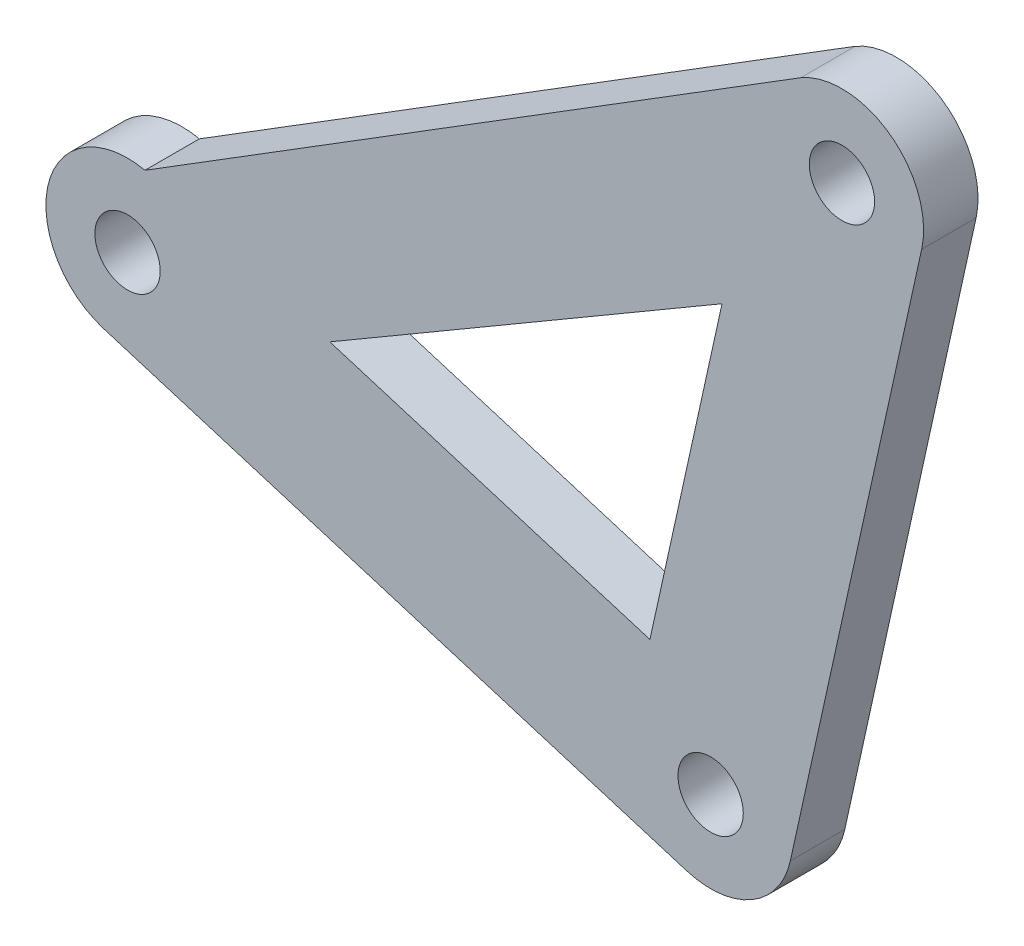
ISO-10303-21;
HEADER;
FILE_DESCRIPTION(('STEP AP214'),'2;1');
FILE_NAME('part.step','',(''),(''),'','','');
FILE_SCHEMA(('AUTOMOTIVE_DESIGN { 1 0 10303 214 1 1 1 1 }'));
ENDSEC;
DATA;
#1=APPLICATION_CONTEXT('core data for automotive mechanical design processes');
#2=APPLICATION_PROTOCOL_DEFINITION('international standard','automotive_design',2000,#1);
#3=PRODUCT_CONTEXT('',#1,'mechanical');
#4=PRODUCT('Part','Part','',(#3));
#5=PRODUCT_RELATED_PRODUCT_CATEGORY('part','',(#4));
#6=PRODUCT_DEFINITION_FORMATION('','',#4);
#7=PRODUCT_DEFINITION_CONTEXT('part definition',#1,'design');
#8=PRODUCT_DEFINITION('design','',#6,#7);
#9=PRODUCT_DEFINITION_SHAPE('','',#8);
#10=(LENGTH_UNIT() NAMED_UNIT(*) SI_UNIT(.MILLI.,.METRE.));
#11=(NAMED_UNIT(*) PLANE_ANGLE_UNIT() SI_UNIT($,.RADIAN.));
#12=(NAMED_UNIT(*) SI_UNIT($,.STERADIAN.) SOLID_ANGLE_UNIT());
#13=UNCERTAINTY_MEASURE_WITH_UNIT(LENGTH_MEASURE(1.E-05),#10,'distance_accuracy_value','');
#14=(GEOMETRIC_REPRESENTATION_CONTEXT(3) GLOBAL_UNCERTAINTY_ASSIGNED_CONTEXT((#13)) GLOBAL_UNIT_ASSIGNED_CONTEXT((#10,
#11,#12)) REPRESENTATION_CONTEXT('',''));
#15=CARTESIAN_POINT('',(0.,0.,0.));
#16=DIRECTION('',(0.,0.,1.));
#17=DIRECTION('',(1.,0.,0.));
#18=AXIS2_PLACEMENT_3D('',#15,#16,#17);
#19=CARTESIAN_POINT('',(-67.5130338509924,14.8921394679262,-5.));
#20=DIRECTION('',(0.976525116836569,-0.215403565864925,0.));
#21=DIRECTION('',(0.215403565864925,0.976525116836569,0.));
#22=AXIS2_PLACEMENT_3D('',#19,#20,#21);
#23=PLANE('',#22);
#24=DIRECTION('',(0.215403565864925,0.976525116836569,0.));
#25=VECTOR('',#24,1.);
#26=CARTESIAN_POINT('',(-67.5130338509924,14.8921394679262,0.));
#27=LINE('',#26,#25);
#28=CARTESIAN_POINT('',(-69.5751762676714,5.5434833475172,0.));
#29=VERTEX_POINT('',#28);
#30=CARTESIAN_POINT('',(-62.9531698060001,35.5641360127153,0.));
#31=VERTEX_POINT('',#30);
#32=EDGE_CURVE('E159',#29,#31,#27,.T.);
#33=ORIENTED_EDGE('',*,*,#32,.T.);
#34=DIRECTION('',(0.,0.,1.));
#35=VECTOR('',#34,1.);
#36=CARTESIAN_POINT('',(-62.9531698060001,35.5641360127153,-5.));
#37=LINE('',#36,#35);
#38=CARTESIAN_POINT('',(-62.9531698060001,35.5641360127153,-5.));
#39=VERTEX_POINT('',#38);
#40=EDGE_CURVE('E11',#39,#31,#37,.T.);
#41=ORIENTED_EDGE('',*,*,#40,.F.);
#42=DIRECTION('',(0.215403565864925,0.976525116836569,0.));
#43=VECTOR('',#42,1.);
#44=CARTESIAN_POINT('',(-67.5130338509924,14.8921394679262,-5.));
#45=LINE('',#44,#43);
#46=CARTESIAN_POINT('',(-69.5751762676714,5.5434833475172,-5.));
#47=VERTEX_POINT('',#46);
#48=EDGE_CURVE('E120',#47,#39,#45,.T.);
#49=ORIENTED_EDGE('',*,*,#48,.F.);
#50=DIRECTION('',(0.,0.,1.));
#51=VECTOR('',#50,1.);
#52=CARTESIAN_POINT('',(-69.5751762676714,5.5434833475172,-5.));
#53=LINE('',#52,#51);
#54=EDGE_CURVE('E125',#47,#29,#53,.T.);
#55=ORIENTED_EDGE('',*,*,#54,.T.);
#56=EDGE_LOOP('',(#33,#41,#49,#55));
#57=FACE_BOUND('',#56,.T.);
#58=ADVANCED_FACE('F39',(#57),#23,.F.);
#59=CARTESIAN_POINT('',(-31.5076413819131,53.9341962318663,-5.));
#60=DIRECTION('',(-0.504420709932172,0.86345801715632,0.));
#61=DIRECTION('',(-0.86345801715632,-0.504420709932172,0.));
#62=AXIS2_PLACEMENT_3D('',#59,#60,#61);
#63=PLANE('',#62);
#64=DIRECTION('',(-0.86345801715632,-0.504420709932172,0.));
#65=VECTOR('',#64,1.);
#66=CARTESIAN_POINT('',(-31.5076413819131,53.9341962318663,0.));
#67=LINE('',#66,#65);
#68=CARTESIAN_POINT('',(-98.978129472026,14.5188328607905,0.));
#69=VERTEX_POINT('',#68);
#70=EDGE_CURVE('E86',#31,#69,#67,.T.);
#71=ORIENTED_EDGE('',*,*,#70,.T.);
#72=DIRECTION('',(0.,0.,1.));
#73=VECTOR('',#72,1.);
#74=CARTESIAN_POINT('',(-98.978129472026,14.5188328607905,-5.));
#75=LINE('',#74,#73);
#76=CARTESIAN_POINT('',(-98.978129472026,14.5188328607905,-5.));
#77=VERTEX_POINT('',#76);
#78=EDGE_CURVE('E49',#77,#69,#75,.T.);
#79=ORIENTED_EDGE('',*,*,#78,.F.);
#80=DIRECTION('',(-0.86345801715632,-0.504420709932172,0.));
#81=VECTOR('',#80,1.);
#82=CARTESIAN_POINT('',(-31.5076413819131,53.9341962318663,-5.));
#83=LINE('',#82,#81);
#84=EDGE_CURVE('E57',#39,#77,#83,.T.);
#85=ORIENTED_EDGE('',*,*,#84,.F.);
#86=ORIENTED_EDGE('',*,*,#40,.T.);
#87=EDGE_LOOP('',(#71,#79,#85,#86));
#88=FACE_BOUND('',#87,.T.);
#89=ADVANCED_FACE('F217',(#88),#63,.F.);
#90=CARTESIAN_POINT('',(-8.76177626714497,-28.7032941936022,-5.));
#91=DIRECTION('',(-0.291954153357192,-0.956432314561509,0.));
#92=DIRECTION('',(0.956432314561509,-0.291954153357193,0.));
#93=AXIS2_PLACEMENT_3D('',#90,#91,#92);
#94=PLANE('',#93);
#95=DIRECTION('',(0.956432314561509,-0.291954153357192,0.));
#96=VECTOR('',#95,1.);
#97=CARTESIAN_POINT('',(-8.76177626714497,-28.7032941936022,0.));
#98=LINE('',#97,#96);
#99=CARTESIAN_POINT('',(-119.749865765623,5.17619022879147,0.));
#100=VERTEX_POINT('',#99);
#101=CARTESIAN_POINT('',(-66.1896561501789,-11.1732423592113,0.));
#102=VERTEX_POINT('',#101);
#103=EDGE_CURVE('E140',#100,#102,#98,.T.);
#104=ORIENTED_EDGE('',*,*,#103,.F.);
#105=DIRECTION('',(0.,0.,1.));
#106=VECTOR('',#105,1.);
#107=CARTESIAN_POINT('',(-119.749865765623,5.17619022879147,-5.));
#108=LINE('',#107,#106);
#109=CARTESIAN_POINT('',(-119.749865765623,5.17619022879147,-5.));
#110=VERTEX_POINT('',#109);
#111=EDGE_CURVE('E130',#110,#100,#108,.T.);
#112=ORIENTED_EDGE('',*,*,#111,.F.);
#113=DIRECTION('',(0.956432314561509,-0.291954153357192,0.));
#114=VECTOR('',#113,1.);
#115=CARTESIAN_POINT('',(-8.76177626714497,-28.7032941936022,-5.));
#116=LINE('',#115,#114);
#117=CARTESIAN_POINT('',(-66.1896561501789,-11.1732423592113,-5.));
#118=VERTEX_POINT('',#117);
#119=EDGE_CURVE('E162',#110,#118,#116,.T.);
#120=ORIENTED_EDGE('',*,*,#119,.T.);
#121=DIRECTION('',(0.,0.,1.));
#122=VECTOR('',#121,1.);
#123=CARTESIAN_POINT('',(-66.1896561501789,-11.1732423592113,-5.));
#124=LINE('',#123,#122);
#125=EDGE_CURVE('E43',#118,#102,#124,.T.);
#126=ORIENTED_EDGE('',*,*,#125,.T.);
#127=EDGE_LOOP('',(#104,#112,#120,#126));
#128=FACE_BOUND('',#127,.T.);
#129=ADVANCED_FACE('F41',(#128),#94,.T.);
#130=CARTESIAN_POINT('',(-117.560209615445,12.3494325880028,-5.));
#131=DIRECTION('',(0.,0.,1.));
#132=DIRECTION('',(1.,0.,0.));
#133=AXIS2_PLACEMENT_3D('',#130,#131,#132);
#134=CYLINDRICAL_SURFACE('',#133,7.50000000000001);
#135=CARTESIAN_POINT('',(-117.560209615445,12.3494325880028,0.));
#136=DIRECTION('',(0.,0.,1.));
#137=DIRECTION('',(1.,0.,0.));
#138=AXIS2_PLACEMENT_3D('',#135,#136,#137);
#139=CIRCLE('',#138,7.50000000000001);
#140=CARTESIAN_POINT('',(-115.960936395005,19.6769372905864,0.));
#141=VERTEX_POINT('',#140);
#142=EDGE_CURVE('E156',#141,#100,#139,.T.);
#143=ORIENTED_EDGE('',*,*,#142,.F.);
#144=DIRECTION('',(0.,0.,1.));
#145=VECTOR('',#144,1.);
#146=CARTESIAN_POINT('',(-115.960936395005,19.6769372905864,-5.));
#147=LINE('',#146,#145);
#148=CARTESIAN_POINT('',(-115.960936395005,19.6769372905864,-5.));
#149=VERTEX_POINT('',#148);
#150=EDGE_CURVE('E166',#149,#141,#147,.T.);
#151=ORIENTED_EDGE('',*,*,#150,.F.);
#152=CARTESIAN_POINT('',(-117.560209615445,12.3494325880028,-5.));
#153=DIRECTION('',(0.,0.,1.));
#154=DIRECTION('',(1.,0.,0.));
#155=AXIS2_PLACEMENT_3D('',#152,#153,#154);
#156=CIRCLE('',#155,7.50000000000001);
#157=EDGE_CURVE('E132',#149,#110,#156,.T.);
#158=ORIENTED_EDGE('',*,*,#157,.T.);
#159=ORIENTED_EDGE('',*,*,#111,.T.);
#160=EDGE_LOOP('',(#143,#151,#158,#159));
#161=FACE_BOUND('',#160,.T.);
#162=ADVANCED_FACE('F183',(#161),#134,.T.);
#163=CARTESIAN_POINT('',(-41.1933079282723,66.200879947341,-5.));
#164=DIRECTION('',(-0.528317135641569,0.849047115410852,0.));
#165=DIRECTION('',(-0.849047115410852,-0.528317135641569,0.));
#166=AXIS2_PLACEMENT_3D('',#163,#164,#165);
#167=PLANE('',#166);
#168=DIRECTION('',(-0.849047115410852,-0.528317135641569,0.));
#169=VECTOR('',#168,1.);
#170=CARTESIAN_POINT('',(-41.1933079282723,66.200879947341,0.));
#171=LINE('',#170,#169);
#172=CARTESIAN_POINT('',(-55.7205556360555,57.1613416715203,0.));
#173=VERTEX_POINT('',#172);
#174=EDGE_CURVE('E153',#173,#141,#171,.T.);
#175=ORIENTED_EDGE('',*,*,#174,.F.);
#176=DIRECTION('',(0.,0.,1.));
#177=VECTOR('',#176,1.);
#178=CARTESIAN_POINT('',(-55.7205556360555,57.1613416715203,-5.));
#179=LINE('',#178,#177);
#180=CARTESIAN_POINT('',(-55.7205556360555,57.1613416715203,-5.));
#181=VERTEX_POINT('',#180);
#182=EDGE_CURVE('E168',#181,#173,#179,.T.);
#183=ORIENTED_EDGE('',*,*,#182,.F.);
#184=DIRECTION('',(-0.849047115410852,-0.528317135641569,0.));
#185=VECTOR('',#184,1.);
#186=CARTESIAN_POINT('',(-41.1933079282723,66.200879947341,-5.));
#187=LINE('',#186,#185);
#188=EDGE_CURVE('E135',#181,#149,#187,.T.);
#189=ORIENTED_EDGE('',*,*,#188,.T.);
#190=ORIENTED_EDGE('',*,*,#150,.T.);
#191=EDGE_LOOP('',(#175,#183,#189,#190));
#192=FACE_BOUND('',#191,.T.);
#193=ADVANCED_FACE('F202',(#192),#167,.T.);
#194=CARTESIAN_POINT('',(-51.9374003115642,50.6854065428479,-5.));
#195=DIRECTION('',(0.,0.,1.));
#196=DIRECTION('',(1.,0.,0.));
#197=AXIS2_PLACEMENT_3D('',#194,#195,#196);
#198=CYLINDRICAL_SURFACE('',#197,7.50000000000001);
#199=CARTESIAN_POINT('',(-51.9374003115642,50.6854065428479,0.));
#200=DIRECTION('',(0.,0.,1.));
#201=DIRECTION('',(1.,0.,0.));
#202=AXIS2_PLACEMENT_3D('',#199,#200,#201);
#203=CIRCLE('',#202,7.50000000000001);
#204=CARTESIAN_POINT('',(-44.6134619352899,49.0698797988609,0.));
#205=VERTEX_POINT('',#204);
#206=EDGE_CURVE('E150',#205,#173,#203,.T.);
#207=ORIENTED_EDGE('',*,*,#206,.F.);
#208=DIRECTION('',(0.,0.,1.));
#209=VECTOR('',#208,1.);
#210=CARTESIAN_POINT('',(-44.6134619352899,49.0698797988609,-5.));
#211=LINE('',#210,#209);
#212=CARTESIAN_POINT('',(-44.6134619352899,49.0698797988609,-5.));
#213=VERTEX_POINT('',#212);
#214=EDGE_CURVE('E170',#213,#205,#211,.T.);
#215=ORIENTED_EDGE('',*,*,#214,.F.);
#216=CARTESIAN_POINT('',(-51.9374003115642,50.6854065428479,-5.));
#217=DIRECTION('',(0.,0.,1.));
#218=DIRECTION('',(1.,0.,0.));
#219=AXIS2_PLACEMENT_3D('',#216,#217,#218);
#220=CIRCLE('',#219,7.50000000000001);
#221=EDGE_CURVE('E199',#213,#181,#220,.T.);
#222=ORIENTED_EDGE('',*,*,#221,.T.);
#223=ORIENTED_EDGE('',*,*,#182,.T.);
#224=EDGE_LOOP('',(#207,#215,#222,#223));
#225=FACE_BOUND('',#224,.T.);
#226=ADVANCED_FACE('F206',(#225),#198,.T.);
#227=CARTESIAN_POINT('',(-52.8651570984439,11.6610859799524,-5.));
#228=DIRECTION('',(0.976525116836569,-0.215403565864925,0.));
#229=DIRECTION('',(0.215403565864925,0.976525116836569,0.));
#230=AXIS2_PLACEMENT_3D('',#227,#228,#229);
#231=PLANE('',#230);
#232=DIRECTION('',(0.215403565864925,0.976525116836569,0.));
#233=VECTOR('',#232,1.);
#234=CARTESIAN_POINT('',(-52.8651570984439,11.6610859799524,0.));
#235=LINE('',#234,#233);
#236=CARTESIAN_POINT('',(-56.6760616237257,-5.61552674398693,0.));
#237=VERTEX_POINT('',#236);
#238=EDGE_CURVE('E147',#237,#205,#235,.T.);
#239=ORIENTED_EDGE('',*,*,#238,.F.);
#240=DIRECTION('',(0.,0.,1.));
#241=VECTOR('',#240,1.);
#242=CARTESIAN_POINT('',(-56.6760616237257,-5.61552674398693,-5.));
#243=LINE('',#242,#241);
#244=CARTESIAN_POINT('',(-56.6760616237257,-5.61552674398693,-5.));
#245=VERTEX_POINT('',#244);
#246=EDGE_CURVE('E171',#245,#237,#243,.T.);
#247=ORIENTED_EDGE('',*,*,#246,.F.);
#248=DIRECTION('',(0.215403565864925,0.976525116836569,0.));
#249=VECTOR('',#248,1.);
#250=CARTESIAN_POINT('',(-52.8651570984439,11.6610859799524,-5.));
#251=LINE('',#250,#249);
#252=EDGE_CURVE('E191',#245,#213,#251,.T.);
#253=ORIENTED_EDGE('',*,*,#252,.T.);
#254=ORIENTED_EDGE('',*,*,#214,.T.);
#255=EDGE_LOOP('',(#239,#247,#253,#254));
#256=FACE_BOUND('',#255,.T.);
#257=ADVANCED_FACE('F208',(#256),#231,.T.);
#258=CARTESIAN_POINT('',(-64.,-4.00000000000001,-5.));
#259=DIRECTION('',(0.,0.,1.));
#260=DIRECTION('',(1.,0.,0.));
#261=AXIS2_PLACEMENT_3D('',#258,#259,#260);
#262=CYLINDRICAL_SURFACE('',#261,7.5);
#263=CARTESIAN_POINT('',(-64.,-4.00000000000001,0.));
#264=DIRECTION('',(0.,0.,1.));
#265=DIRECTION('',(1.,0.,0.));
#266=AXIS2_PLACEMENT_3D('',#263,#264,#265);
#267=CIRCLE('',#266,7.5);
#268=EDGE_CURVE('E143',#102,#237,#267,.T.);
#269=ORIENTED_EDGE('',*,*,#268,.F.);
#270=ORIENTED_EDGE('',*,*,#125,.F.);
#271=CARTESIAN_POINT('',(-64.,-4.00000000000001,-5.));
#272=DIRECTION('',(0.,0.,1.));
#273=DIRECTION('',(1.,0.,0.));
#274=AXIS2_PLACEMENT_3D('',#271,#272,#273);
#275=CIRCLE('',#274,7.5);
#276=EDGE_CURVE('E189',#118,#245,#275,.T.);
#277=ORIENTED_EDGE('',*,*,#276,.T.);
#278=ORIENTED_EDGE('',*,*,#246,.T.);
#279=EDGE_LOOP('',(#269,#270,#277,#278));
#280=FACE_BOUND('',#279,.T.);
#281=ADVANCED_FACE('F177',(#280),#262,.T.);
#282=CARTESIAN_POINT('',(-4.3824639667871,-14.3568094751796,-5.));
#283=DIRECTION('',(-0.291954153357193,-0.956432314561509,0.));
#284=DIRECTION('',(0.956432314561509,-0.291954153357193,0.));
#285=AXIS2_PLACEMENT_3D('',#282,#283,#284);
#286=PLANE('',#285);
#287=DIRECTION('',(0.956432314561509,-0.291954153357193,0.));
#288=VECTOR('',#287,1.);
#289=CARTESIAN_POINT('',(-4.3824639667871,-14.3568094751796,0.));
#290=LINE('',#289,#288);
#291=EDGE_CURVE('E127',#69,#29,#290,.T.);
#292=ORIENTED_EDGE('',*,*,#291,.T.);
#293=ORIENTED_EDGE('',*,*,#54,.F.);
#294=DIRECTION('',(0.956432314561509,-0.291954153357193,0.));
#295=VECTOR('',#294,1.);
#296=CARTESIAN_POINT('',(-4.3824639667871,-14.3568094751796,-5.));
#297=LINE('',#296,#295);
#298=EDGE_CURVE('E116',#77,#47,#297,.T.);
#299=ORIENTED_EDGE('',*,*,#298,.F.);
#300=ORIENTED_EDGE('',*,*,#78,.T.);
#301=EDGE_LOOP('',(#292,#293,#299,#300));
#302=FACE_BOUND('',#301,.T.);
#303=ADVANCED_FACE('F126',(#302),#286,.F.);
#304=CARTESIAN_POINT('',(0.,0.,-5.));
#305=DIRECTION('',(0.,0.,1.));
#306=DIRECTION('',(1.,0.,0.));
#307=AXIS2_PLACEMENT_3D('',#304,#305,#306);
#308=PLANE('',#307);
#309=CARTESIAN_POINT('',(-117.560209615445,12.3494325880028,-5.));
#310=DIRECTION('',(0.,0.,1.));
#311=DIRECTION('',(1.,0.,0.));
#312=AXIS2_PLACEMENT_3D('',#309,#310,#311);
#313=CIRCLE('',#312,3.00000000000001);
#314=CARTESIAN_POINT('',(-114.560209615444,12.3494325880028,-5.));
#315=VERTEX_POINT('',#314);
#316=EDGE_CURVE('E144',#315,#315,#313,.T.);
#317=ORIENTED_EDGE('',*,*,#316,.T.);
#318=EDGE_LOOP('',(#317));
#319=FACE_BOUND('',#318,.T.);
#320=CARTESIAN_POINT('',(-64.,-4.,-5.));
#321=DIRECTION('',(0.,0.,1.));
#322=DIRECTION('',(1.,0.,0.));
#323=AXIS2_PLACEMENT_3D('',#320,#321,#322);
#324=CIRCLE('',#323,3.);
#325=CARTESIAN_POINT('',(-61.,-4.,-5.));
#326=VERTEX_POINT('',#325);
#327=EDGE_CURVE('E420',#326,#326,#324,.T.);
#328=ORIENTED_EDGE('',*,*,#327,.T.);
#329=EDGE_LOOP('',(#328));
#330=FACE_BOUND('',#329,.T.);
#331=CARTESIAN_POINT('',(-51.9374003115642,50.6854065428479,-5.));
#332=DIRECTION('',(0.,0.,1.));
#333=DIRECTION('',(1.,0.,0.));
#334=AXIS2_PLACEMENT_3D('',#331,#332,#333);
#335=CIRCLE('',#334,3.00000000000001);
#336=CARTESIAN_POINT('',(-48.9374003115642,50.6854065428479,-5.));
#337=VERTEX_POINT('',#336);
#338=EDGE_CURVE('E194',#337,#337,#335,.T.);
#339=ORIENTED_EDGE('',*,*,#338,.T.);
#340=EDGE_LOOP('',(#339));
#341=FACE_BOUND('',#340,.T.);
#342=ORIENTED_EDGE('',*,*,#119,.F.);
#343=ORIENTED_EDGE('',*,*,#157,.F.);
#344=ORIENTED_EDGE('',*,*,#188,.F.);
#345=ORIENTED_EDGE('',*,*,#221,.F.);
#346=ORIENTED_EDGE('',*,*,#252,.F.);
#347=ORIENTED_EDGE('',*,*,#276,.F.);
#348=EDGE_LOOP('',(#342,#343,#344,#345,#346,#347));
#349=FACE_BOUND('',#348,.T.);
#350=ORIENTED_EDGE('',*,*,#48,.T.);
#351=ORIENTED_EDGE('',*,*,#84,.T.);
#352=ORIENTED_EDGE('',*,*,#298,.T.);
#353=EDGE_LOOP('',(#350,#351,#352));
#354=FACE_BOUND('',#353,.T.);
#355=ADVANCED_FACE('F118',(#319,#330,#341,#349,#354),#308,.F.);
#356=CARTESIAN_POINT('',(0.,0.,0.));
#357=DIRECTION('',(0.,0.,1.));
#358=DIRECTION('',(1.,0.,0.));
#359=AXIS2_PLACEMENT_3D('',#356,#357,#358);
#360=PLANE('',#359);
#361=CARTESIAN_POINT('',(-117.560209615445,12.3494325880028,0.));
#362=DIRECTION('',(0.,0.,1.));
#363=DIRECTION('',(1.,0.,0.));
#364=AXIS2_PLACEMENT_3D('',#361,#362,#363);
#365=CIRCLE('',#364,3.00000000000001);
#366=CARTESIAN_POINT('',(-114.560209615444,12.3494325880028,0.));
#367=VERTEX_POINT('',#366);
#368=EDGE_CURVE('E415',#367,#367,#365,.T.);
#369=ORIENTED_EDGE('',*,*,#368,.F.);
#370=EDGE_LOOP('',(#369));
#371=FACE_BOUND('',#370,.T.);
#372=CARTESIAN_POINT('',(-64.,-4.,0.));
#373=DIRECTION('',(0.,0.,1.));
#374=DIRECTION('',(1.,0.,0.));
#375=AXIS2_PLACEMENT_3D('',#372,#373,#374);
#376=CIRCLE('',#375,3.);
#377=CARTESIAN_POINT('',(-61.,-4.,0.));
#378=VERTEX_POINT('',#377);
#379=EDGE_CURVE('E416',#378,#378,#376,.T.);
#380=ORIENTED_EDGE('',*,*,#379,.F.);
#381=EDGE_LOOP('',(#380));
#382=FACE_BOUND('',#381,.T.);
#383=CARTESIAN_POINT('',(-51.9374003115642,50.6854065428479,0.));
#384=DIRECTION('',(0.,0.,1.));
#385=DIRECTION('',(1.,0.,0.));
#386=AXIS2_PLACEMENT_3D('',#383,#384,#385);
#387=CIRCLE('',#386,3.00000000000001);
#388=CARTESIAN_POINT('',(-48.9374003115642,50.6854065428479,0.));
#389=VERTEX_POINT('',#388);
#390=EDGE_CURVE('E424',#389,#389,#387,.T.);
#391=ORIENTED_EDGE('',*,*,#390,.F.);
#392=EDGE_LOOP('',(#391));
#393=FACE_BOUND('',#392,.T.);
#394=ORIENTED_EDGE('',*,*,#103,.T.);
#395=ORIENTED_EDGE('',*,*,#268,.T.);
#396=ORIENTED_EDGE('',*,*,#238,.T.);
#397=ORIENTED_EDGE('',*,*,#206,.T.);
#398=ORIENTED_EDGE('',*,*,#174,.T.);
#399=ORIENTED_EDGE('',*,*,#142,.T.);
#400=EDGE_LOOP('',(#394,#395,#396,#397,#398,#399));
#401=FACE_BOUND('',#400,.T.);
#402=ORIENTED_EDGE('',*,*,#32,.F.);
#403=ORIENTED_EDGE('',*,*,#291,.F.);
#404=ORIENTED_EDGE('',*,*,#70,.F.);
#405=EDGE_LOOP('',(#402,#403,#404));
#406=FACE_BOUND('',#405,.T.);
#407=ADVANCED_FACE('F179',(#371,#382,#393,#401,#406),#360,.T.);
#408=CARTESIAN_POINT('',(-51.9374003115642,50.6854065428479,-5.));
#409=DIRECTION('',(0.,0.,1.));
#410=DIRECTION('',(1.,0.,0.));
#411=AXIS2_PLACEMENT_3D('',#408,#409,#410);
#412=CYLINDRICAL_SURFACE('',#411,3.00000000000001);
#413=ORIENTED_EDGE('',*,*,#338,.F.);
#414=EDGE_LOOP('',(#413));
#415=FACE_BOUND('',#414,.T.);
#416=ORIENTED_EDGE('',*,*,#390,.T.);
#417=EDGE_LOOP('',(#416));
#418=FACE_BOUND('',#417,.T.);
#419=ADVANCED_FACE('F279',(#415,#418),#412,.F.);
#420=CARTESIAN_POINT('',(-64.,-4.,-5.));
#421=DIRECTION('',(0.,0.,1.));
#422=DIRECTION('',(1.,0.,0.));
#423=AXIS2_PLACEMENT_3D('',#420,#421,#422);
#424=CYLINDRICAL_SURFACE('',#423,3.);
#425=ORIENTED_EDGE('',*,*,#327,.F.);
#426=EDGE_LOOP('',(#425));
#427=FACE_BOUND('',#426,.T.);
#428=ORIENTED_EDGE('',*,*,#379,.T.);
#429=EDGE_LOOP('',(#428));
#430=FACE_BOUND('',#429,.T.);
#431=ADVANCED_FACE('F290',(#427,#430),#424,.F.);
#432=CARTESIAN_POINT('',(-117.560209615445,12.3494325880028,-5.));
#433=DIRECTION('',(0.,0.,1.));
#434=DIRECTION('',(1.,0.,0.));
#435=AXIS2_PLACEMENT_3D('',#432,#433,#434);
#436=CYLINDRICAL_SURFACE('',#435,3.00000000000001);
#437=ORIENTED_EDGE('',*,*,#316,.F.);
#438=EDGE_LOOP('',(#437));
#439=FACE_BOUND('',#438,.T.);
#440=ORIENTED_EDGE('',*,*,#368,.T.);
#441=EDGE_LOOP('',(#440));
#442=FACE_BOUND('',#441,.T.);
#443=ADVANCED_FACE('F301',(#439,#442),#436,.F.);
#444=CLOSED_SHELL('',(#58,#89,#129,#162,#193,#226,#257,#281,#303,#355,#407,#419,#431,#443));
#445=MANIFOLD_SOLID_BREP('B2',#444);
#446=ADVANCED_BREP_SHAPE_REPRESENTATION('',(#18,#445),#14);
#447=SHAPE_DEFINITION_REPRESENTATION(#9,#446);
ENDSEC;
END-ISO-10303-21;
